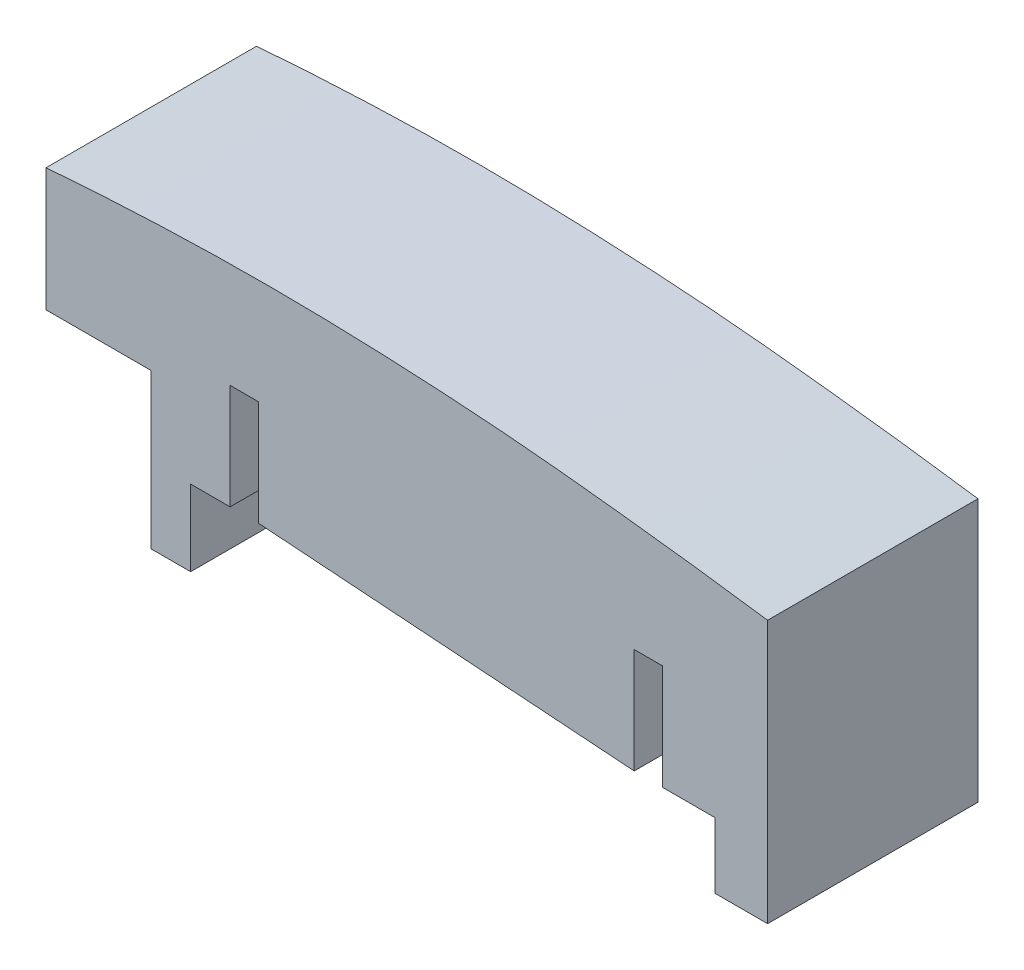
ISO-10303-21;
HEADER;
FILE_DESCRIPTION(('STEP AP214'),'2;1');
FILE_NAME('part.step','',(''),(''),'','','');
FILE_SCHEMA(('AUTOMOTIVE_DESIGN { 1 0 10303 214 1 1 1 1 }'));
ENDSEC;
DATA;
#1=APPLICATION_CONTEXT('core data for automotive mechanical design processes');
#2=APPLICATION_PROTOCOL_DEFINITION('international standard','automotive_design',2000,#1);
#3=PRODUCT_CONTEXT('',#1,'mechanical');
#4=PRODUCT('Part','Part','',(#3));
#5=PRODUCT_RELATED_PRODUCT_CATEGORY('part','',(#4));
#6=PRODUCT_DEFINITION_FORMATION('','',#4);
#7=PRODUCT_DEFINITION_CONTEXT('part definition',#1,'design');
#8=PRODUCT_DEFINITION('design','',#6,#7);
#9=PRODUCT_DEFINITION_SHAPE('','',#8);
#10=(LENGTH_UNIT() NAMED_UNIT(*) SI_UNIT(.MILLI.,.METRE.));
#11=(NAMED_UNIT(*) PLANE_ANGLE_UNIT() SI_UNIT($,.RADIAN.));
#12=(NAMED_UNIT(*) SI_UNIT($,.STERADIAN.) SOLID_ANGLE_UNIT());
#13=UNCERTAINTY_MEASURE_WITH_UNIT(LENGTH_MEASURE(1.E-05),#10,'distance_accuracy_value','');
#14=(GEOMETRIC_REPRESENTATION_CONTEXT(3) GLOBAL_UNCERTAINTY_ASSIGNED_CONTEXT((#13)) GLOBAL_UNIT_ASSIGNED_CONTEXT((#10,
#11,#12)) REPRESENTATION_CONTEXT('',''));
#15=CARTESIAN_POINT('',(0.,0.,0.));
#16=DIRECTION('',(0.,0.,1.));
#17=DIRECTION('',(1.,0.,0.));
#18=AXIS2_PLACEMENT_3D('',#15,#16,#17);
#19=CARTESIAN_POINT('',(2295.10171506552,2967.62554905265,25.4));
#20=CARTESIAN_POINT('',(2290.06442446586,2968.34608124292,25.4));
#21=CARTESIAN_POINT('',(2285.01231095638,2969.0082222592,25.4));
#22=CARTESIAN_POINT('',(2275.66168840668,2970.09585933198,25.4));
#23=CARTESIAN_POINT('',(2271.46891104018,2970.56199263121,25.4));
#24=CARTESIAN_POINT('',(2263.712580892,2971.28406665262,25.4));
#25=CARTESIAN_POINT('',(2260.22175859021,2971.54419176705,25.4));
#26=CARTESIAN_POINT('',(2253.37604568081,2971.9627391919,25.4));
#27=CARTESIAN_POINT('',(2249.94437688068,2972.13076012665,25.4));
#28=CARTESIAN_POINT('',(2239.63060687212,2972.49491008887,25.4));
#29=CARTESIAN_POINT('',(2232.68443342731,2972.53940645631,25.4));
#30=CARTESIAN_POINT('',(2220.02607753454,2972.17801152931,25.4));
#31=CARTESIAN_POINT('',(2214.35356363256,2971.87581349315,25.4));
#32=CARTESIAN_POINT('',(2208.6346229576,2971.42471690238,25.4));
#33=CARTESIAN_POINT('',(2208.42061258464,2971.40783626747,25.4));
#34=CARTESIAN_POINT('',(2208.20653719768,2971.39074712157,25.4));
#35=CARTESIAN_POINT('',(2207.99241506552,2971.3735080559,25.4));
#36=B_SPLINE_CURVE_WITH_KNOTS('',3,(#19,#20,#21,#22,#23,#24,#25,#26,#27,#28,#29,#30,#31,#32,#33,
#34,#35),.UNSPECIFIED.,.F.,.F.,(4,2,2,2,2,2,3,4),(8.10263109564684,8.69301522847715,
9.18839543822775,9.58192884783723,9.97546225744671,10.7625290766657,11.4141270933179,
11.4385107584906),.UNSPECIFIED.);
#37=DIRECTION('',(0.,0.,-1.));
#38=VECTOR('',#37,1.);
#39=SURFACE_OF_LINEAR_EXTRUSION('',#36,#38);
#40=CARTESIAN_POINT('',(2295.10171506552,2967.62554905265,0.));
#41=CARTESIAN_POINT('',(2290.06442446586,2968.34608124292,0.));
#42=CARTESIAN_POINT('',(2285.01231095638,2969.0082222592,0.));
#43=CARTESIAN_POINT('',(2275.66168840668,2970.09585933198,0.));
#44=CARTESIAN_POINT('',(2271.46891104018,2970.56199263121,0.));
#45=CARTESIAN_POINT('',(2263.712580892,2971.28406665262,0.));
#46=CARTESIAN_POINT('',(2260.22175859021,2971.54419176705,0.));
#47=CARTESIAN_POINT('',(2253.37604568081,2971.9627391919,0.));
#48=CARTESIAN_POINT('',(2249.94437688068,2972.13076012665,0.));
#49=CARTESIAN_POINT('',(2239.63060687212,2972.49491008887,0.));
#50=CARTESIAN_POINT('',(2232.68443342731,2972.53940645631,0.));
#51=CARTESIAN_POINT('',(2220.02607753454,2972.17801152931,0.));
#52=CARTESIAN_POINT('',(2214.35356363256,2971.87581349315,0.));
#53=CARTESIAN_POINT('',(2208.6346229576,2971.42471690238,0.));
#54=CARTESIAN_POINT('',(2208.42061258464,2971.40783626747,0.));
#55=CARTESIAN_POINT('',(2208.20653719768,2971.39074712157,0.));
#56=CARTESIAN_POINT('',(2207.99241506552,2971.3735080559,0.));
#57=B_SPLINE_CURVE_WITH_KNOTS('',3,(#40,#41,#42,#43,#44,#45,#46,#47,#48,#49,#50,#51,#52,#53,#54,
#55,#56),.UNSPECIFIED.,.F.,.F.,(4,2,2,2,2,2,3,4),(8.10263109564684,8.69301522847715,
9.18839543822775,9.58192884783723,9.97546225744671,10.7625290766657,11.4141270933179,
11.4385107584906),.UNSPECIFIED.);
#58=CARTESIAN_POINT('',(2295.10171506552,2967.62554905265,0.));
#59=VERTEX_POINT('',#58);
#60=CARTESIAN_POINT('',(2207.99241506552,2971.3735080559,0.));
#61=VERTEX_POINT('',#60);
#62=EDGE_CURVE('E190',#59,#61,#57,.T.);
#63=ORIENTED_EDGE('',*,*,#62,.T.);
#64=DIRECTION('',(0.,0.,-1.));
#65=VECTOR('',#64,1.);
#66=CARTESIAN_POINT('',(2207.99241506552,2971.3735080559,25.4));
#67=LINE('',#66,#65);
#68=CARTESIAN_POINT('',(2207.99241506552,2971.3735080559,25.4));
#69=VERTEX_POINT('',#68);
#70=EDGE_CURVE('E11',#69,#61,#67,.T.);
#71=ORIENTED_EDGE('',*,*,#70,.F.);
#72=CARTESIAN_POINT('',(2295.10171506552,2967.62554905265,25.4));
#73=VERTEX_POINT('',#72);
#74=EDGE_CURVE('E229',#73,#69,#36,.T.);
#75=ORIENTED_EDGE('',*,*,#74,.F.);
#76=DIRECTION('',(0.,0.,-1.));
#77=VECTOR('',#76,1.);
#78=CARTESIAN_POINT('',(2295.10171506552,2967.62554905265,25.4));
#79=LINE('',#78,#77);
#80=EDGE_CURVE('E186',#73,#59,#79,.T.);
#81=ORIENTED_EDGE('',*,*,#80,.T.);
#82=EDGE_LOOP('',(#63,#71,#75,#81));
#83=FACE_BOUND('',#82,.T.);
#84=ADVANCED_FACE('F33',(#83),#39,.F.);
#85=CARTESIAN_POINT('',(2207.99241506552,2971.3735080559,25.4));
#86=DIRECTION('',(1.,-1.19587380324612E-13,0.));
#87=DIRECTION('',(1.19587380324612E-13,1.,0.));
#88=AXIS2_PLACEMENT_3D('',#85,#86,#87);
#89=PLANE('',#88);
#90=DIRECTION('',(-1.19587380324612E-13,-1.,0.));
#91=VECTOR('',#90,1.);
#92=CARTESIAN_POINT('',(2207.99241506552,2971.3735080559,0.));
#93=LINE('',#92,#91);
#94=CARTESIAN_POINT('',(2207.99241506552,2956.519458786,0.));
#95=VERTEX_POINT('',#94);
#96=EDGE_CURVE('E195',#61,#95,#93,.T.);
#97=ORIENTED_EDGE('',*,*,#96,.T.);
#98=DIRECTION('',(0.,0.,-1.));
#99=VECTOR('',#98,1.);
#100=CARTESIAN_POINT('',(2207.99241506552,2956.519458786,25.4));
#101=LINE('',#100,#99);
#102=CARTESIAN_POINT('',(2207.99241506552,2956.519458786,25.4));
#103=VERTEX_POINT('',#102);
#104=EDGE_CURVE('E42',#103,#95,#101,.T.);
#105=ORIENTED_EDGE('',*,*,#104,.F.);
#106=DIRECTION('',(-1.19587380324612E-13,-1.,0.));
#107=VECTOR('',#106,1.);
#108=CARTESIAN_POINT('',(2207.99241506552,2971.3735080559,25.4));
#109=LINE('',#108,#107);
#110=EDGE_CURVE('E123',#69,#103,#109,.T.);
#111=ORIENTED_EDGE('',*,*,#110,.F.);
#112=ORIENTED_EDGE('',*,*,#70,.T.);
#113=EDGE_LOOP('',(#97,#105,#111,#112));
#114=FACE_BOUND('',#113,.T.);
#115=ADVANCED_FACE('F337',(#114),#89,.F.);
#116=CARTESIAN_POINT('',(2220.69241506551,2956.51945878599,25.4));
#117=DIRECTION('',(1.04902962956743E-13,1.,0.));
#118=DIRECTION('',(-1.,1.04902962956743E-13,0.));
#119=AXIS2_PLACEMENT_3D('',#116,#117,#118);
#120=PLANE('',#119);
#121=DIRECTION('',(1.,-1.04902962956743E-13,0.));
#122=VECTOR('',#121,1.);
#123=CARTESIAN_POINT('',(2220.69241506551,2956.51945878599,0.));
#124=LINE('',#123,#122);
#125=CARTESIAN_POINT('',(2220.69241506551,2956.51945878599,0.));
#126=VERTEX_POINT('',#125);
#127=EDGE_CURVE('E200',#95,#126,#124,.T.);
#128=ORIENTED_EDGE('',*,*,#127,.T.);
#129=DIRECTION('',(0.,0.,-1.));
#130=VECTOR('',#129,1.);
#131=CARTESIAN_POINT('',(2220.69241506551,2956.51945878599,25.4));
#132=LINE('',#131,#130);
#133=CARTESIAN_POINT('',(2220.69241506551,2956.51945878599,25.4));
#134=VERTEX_POINT('',#133);
#135=EDGE_CURVE('E266',#134,#126,#132,.T.);
#136=ORIENTED_EDGE('',*,*,#135,.F.);
#137=DIRECTION('',(1.,-1.04902962956743E-13,0.));
#138=VECTOR('',#137,1.);
#139=CARTESIAN_POINT('',(2220.69241506551,2956.51945878599,25.4));
#140=LINE('',#139,#138);
#141=EDGE_CURVE('E274',#103,#134,#140,.T.);
#142=ORIENTED_EDGE('',*,*,#141,.F.);
#143=ORIENTED_EDGE('',*,*,#104,.T.);
#144=EDGE_LOOP('',(#128,#136,#142,#143));
#145=FACE_BOUND('',#144,.T.);
#146=ADVANCED_FACE('F272',(#145),#120,.F.);
#147=CARTESIAN_POINT('',(2220.69241506551,2956.51945878599,25.4));
#148=DIRECTION('',(1.,1.19070852667713E-13,0.));
#149=DIRECTION('',(-1.19070852667713E-13,1.,0.));
#150=AXIS2_PLACEMENT_3D('',#147,#148,#149);
#151=PLANE('',#150);
#152=DIRECTION('',(1.19070852667713E-13,-1.,0.));
#153=VECTOR('',#152,1.);
#154=CARTESIAN_POINT('',(2220.69241506551,2956.51945878599,0.));
#155=LINE('',#154,#153);
#156=CARTESIAN_POINT('',(2220.69241506552,2937.87135138185,0.));
#157=VERTEX_POINT('',#156);
#158=EDGE_CURVE('E202',#126,#157,#155,.T.);
#159=ORIENTED_EDGE('',*,*,#158,.T.);
#160=DIRECTION('',(0.,0.,-1.));
#161=VECTOR('',#160,1.);
#162=CARTESIAN_POINT('',(2220.69241506552,2937.87135138185,25.4));
#163=LINE('',#162,#161);
#164=CARTESIAN_POINT('',(2220.69241506552,2937.87135138185,25.4));
#165=VERTEX_POINT('',#164);
#166=EDGE_CURVE('E263',#165,#157,#163,.T.);
#167=ORIENTED_EDGE('',*,*,#166,.F.);
#168=DIRECTION('',(1.19070852667713E-13,-1.,0.));
#169=VECTOR('',#168,1.);
#170=CARTESIAN_POINT('',(2220.69241506551,2956.51945878599,25.4));
#171=LINE('',#170,#169);
#172=EDGE_CURVE('E292',#134,#165,#171,.T.);
#173=ORIENTED_EDGE('',*,*,#172,.F.);
#174=ORIENTED_EDGE('',*,*,#135,.T.);
#175=EDGE_LOOP('',(#159,#167,#173,#174));
#176=FACE_BOUND('',#175,.T.);
#177=ADVANCED_FACE('F283',(#176),#151,.F.);
#178=CARTESIAN_POINT('',(2225.45491506552,2937.87135138185,25.4));
#179=DIRECTION('',(1.86494156367445E-13,1.,0.));
#180=DIRECTION('',(-1.,1.86494156367445E-13,0.));
#181=AXIS2_PLACEMENT_3D('',#178,#179,#180);
#182=PLANE('',#181);
#183=DIRECTION('',(1.,-1.86494156367445E-13,0.));
#184=VECTOR('',#183,1.);
#185=CARTESIAN_POINT('',(2225.45491506552,2937.87135138185,0.));
#186=LINE('',#185,#184);
#187=CARTESIAN_POINT('',(2225.45491506552,2937.87135138185,0.));
#188=VERTEX_POINT('',#187);
#189=EDGE_CURVE('E204',#157,#188,#186,.T.);
#190=ORIENTED_EDGE('',*,*,#189,.T.);
#191=DIRECTION('',(0.,0.,-1.));
#192=VECTOR('',#191,1.);
#193=CARTESIAN_POINT('',(2225.45491506552,2937.87135138185,25.4));
#194=LINE('',#193,#192);
#195=CARTESIAN_POINT('',(2225.45491506552,2937.87135138185,25.4));
#196=VERTEX_POINT('',#195);
#197=EDGE_CURVE('E260',#196,#188,#194,.T.);
#198=ORIENTED_EDGE('',*,*,#197,.F.);
#199=DIRECTION('',(1.,-1.86494156367445E-13,0.));
#200=VECTOR('',#199,1.);
#201=CARTESIAN_POINT('',(2225.45491506552,2937.87135138185,25.4));
#202=LINE('',#201,#200);
#203=EDGE_CURVE('E289',#165,#196,#202,.T.);
#204=ORIENTED_EDGE('',*,*,#203,.F.);
#205=ORIENTED_EDGE('',*,*,#166,.T.);
#206=EDGE_LOOP('',(#190,#198,#204,#205));
#207=FACE_BOUND('',#206,.T.);
#208=ADVANCED_FACE('F287',(#207),#182,.F.);
#209=CARTESIAN_POINT('',(2225.45491506552,2947.03597977265,25.4));
#210=DIRECTION('',(-1.,0.,0.));
#211=DIRECTION('',(0.,0.,1.));
#212=AXIS2_PLACEMENT_3D('',#209,#210,#211);
#213=PLANE('',#212);
#214=DIRECTION('',(0.,1.,0.));
#215=VECTOR('',#214,1.);
#216=CARTESIAN_POINT('',(2225.45491506552,2947.03597977265,0.));
#217=LINE('',#216,#215);
#218=CARTESIAN_POINT('',(2225.45491506552,2947.03597977265,0.));
#219=VERTEX_POINT('',#218);
#220=EDGE_CURVE('E206',#188,#219,#217,.T.);
#221=ORIENTED_EDGE('',*,*,#220,.T.);
#222=DIRECTION('',(0.,0.,-1.));
#223=VECTOR('',#222,1.);
#224=CARTESIAN_POINT('',(2225.45491506552,2947.03597977265,25.4));
#225=LINE('',#224,#223);
#226=CARTESIAN_POINT('',(2225.45491506552,2947.03597977265,25.4));
#227=VERTEX_POINT('',#226);
#228=EDGE_CURVE('E257',#227,#219,#225,.T.);
#229=ORIENTED_EDGE('',*,*,#228,.F.);
#230=DIRECTION('',(0.,1.,0.));
#231=VECTOR('',#230,1.);
#232=CARTESIAN_POINT('',(2225.45491506552,2947.03597977265,25.4));
#233=LINE('',#232,#231);
#234=EDGE_CURVE('E291',#196,#227,#233,.T.);
#235=ORIENTED_EDGE('',*,*,#234,.F.);
#236=ORIENTED_EDGE('',*,*,#197,.T.);
#237=EDGE_LOOP('',(#221,#229,#235,#236));
#238=FACE_BOUND('',#237,.T.);
#239=ADVANCED_FACE('F350',(#238),#213,.F.);
#240=CARTESIAN_POINT('',(2225.45491506552,2947.03597977265,25.4));
#241=DIRECTION('',(0.,1.,0.));
#242=DIRECTION('',(-1.,0.,0.));
#243=AXIS2_PLACEMENT_3D('',#240,#241,#242);
#244=PLANE('',#243);
#245=DIRECTION('',(1.,0.,0.));
#246=VECTOR('',#245,1.);
#247=CARTESIAN_POINT('',(2225.45491506552,2947.03597977265,0.));
#248=LINE('',#247,#246);
#249=CARTESIAN_POINT('',(2230.21741506552,2947.03597977265,0.));
#250=VERTEX_POINT('',#249);
#251=EDGE_CURVE('E208',#219,#250,#248,.T.);
#252=ORIENTED_EDGE('',*,*,#251,.T.);
#253=DIRECTION('',(0.,0.,-1.));
#254=VECTOR('',#253,1.);
#255=CARTESIAN_POINT('',(2230.21741506552,2947.03597977265,25.4));
#256=LINE('',#255,#254);
#257=CARTESIAN_POINT('',(2230.21741506552,2947.03597977265,25.4));
#258=VERTEX_POINT('',#257);
#259=EDGE_CURVE('E254',#258,#250,#256,.T.);
#260=ORIENTED_EDGE('',*,*,#259,.F.);
#261=DIRECTION('',(1.,0.,0.));
#262=VECTOR('',#261,1.);
#263=CARTESIAN_POINT('',(2225.45491506552,2947.03597977265,25.4));
#264=LINE('',#263,#262);
#265=EDGE_CURVE('E294',#227,#258,#264,.T.);
#266=ORIENTED_EDGE('',*,*,#265,.F.);
#267=ORIENTED_EDGE('',*,*,#228,.T.);
#268=EDGE_LOOP('',(#252,#260,#266,#267));
#269=FACE_BOUND('',#268,.T.);
#270=ADVANCED_FACE('F353',(#269),#244,.F.);
#271=CARTESIAN_POINT('',(2230.21741506552,2959.73597977265,25.4));
#272=DIRECTION('',(-1.,0.,0.));
#273=DIRECTION('',(0.,0.,1.));
#274=AXIS2_PLACEMENT_3D('',#271,#272,#273);
#275=PLANE('',#274);
#276=DIRECTION('',(0.,1.,0.));
#277=VECTOR('',#276,1.);
#278=CARTESIAN_POINT('',(2230.21741506552,2959.73597977265,0.));
#279=LINE('',#278,#277);
#280=CARTESIAN_POINT('',(2230.21741506552,2959.73597977265,0.));
#281=VERTEX_POINT('',#280);
#282=EDGE_CURVE('E210',#250,#281,#279,.T.);
#283=ORIENTED_EDGE('',*,*,#282,.T.);
#284=DIRECTION('',(0.,0.,-1.));
#285=VECTOR('',#284,1.);
#286=CARTESIAN_POINT('',(2230.21741506552,2959.73597977265,25.4));
#287=LINE('',#286,#285);
#288=CARTESIAN_POINT('',(2230.21741506552,2959.73597977265,25.4));
#289=VERTEX_POINT('',#288);
#290=EDGE_CURVE('E251',#289,#281,#287,.T.);
#291=ORIENTED_EDGE('',*,*,#290,.F.);
#292=DIRECTION('',(0.,1.,0.));
#293=VECTOR('',#292,1.);
#294=CARTESIAN_POINT('',(2230.21741506552,2959.73597977265,25.4));
#295=LINE('',#294,#293);
#296=EDGE_CURVE('E300',#258,#289,#295,.T.);
#297=ORIENTED_EDGE('',*,*,#296,.F.);
#298=ORIENTED_EDGE('',*,*,#259,.T.);
#299=EDGE_LOOP('',(#283,#291,#297,#298));
#300=FACE_BOUND('',#299,.T.);
#301=ADVANCED_FACE('F357',(#300),#275,.F.);
#302=CARTESIAN_POINT('',(2230.21741506552,2959.73597977265,25.4));
#303=DIRECTION('',(0.,1.,0.));
#304=DIRECTION('',(0.,0.,1.));
#305=AXIS2_PLACEMENT_3D('',#302,#303,#304);
#306=PLANE('',#305);
#307=DIRECTION('',(1.,0.,0.));
#308=VECTOR('',#307,1.);
#309=CARTESIAN_POINT('',(2230.21741506552,2959.73597977265,0.));
#310=LINE('',#309,#308);
#311=CARTESIAN_POINT('',(2233.62101506552,2959.73597977265,0.));
#312=VERTEX_POINT('',#311);
#313=EDGE_CURVE('E212',#281,#312,#310,.T.);
#314=ORIENTED_EDGE('',*,*,#313,.T.);
#315=DIRECTION('',(0.,0.,-1.));
#316=VECTOR('',#315,1.);
#317=CARTESIAN_POINT('',(2233.62101506552,2959.73597977265,25.4));
#318=LINE('',#317,#316);
#319=CARTESIAN_POINT('',(2233.62101506552,2959.73597977265,25.4));
#320=VERTEX_POINT('',#319);
#321=EDGE_CURVE('E248',#320,#312,#318,.T.);
#322=ORIENTED_EDGE('',*,*,#321,.F.);
#323=DIRECTION('',(1.,0.,0.));
#324=VECTOR('',#323,1.);
#325=CARTESIAN_POINT('',(2230.21741506552,2959.73597977265,25.4));
#326=LINE('',#325,#324);
#327=EDGE_CURVE('E302',#289,#320,#326,.T.);
#328=ORIENTED_EDGE('',*,*,#327,.F.);
#329=ORIENTED_EDGE('',*,*,#290,.T.);
#330=EDGE_LOOP('',(#314,#322,#328,#329));
#331=FACE_BOUND('',#330,.T.);
#332=ADVANCED_FACE('F361',(#331),#306,.F.);
#333=CARTESIAN_POINT('',(2233.62101506552,2959.73597977265,25.4));
#334=DIRECTION('',(1.,0.,0.));
#335=DIRECTION('',(0.,0.,-1.));
#336=AXIS2_PLACEMENT_3D('',#333,#334,#335);
#337=PLANE('',#336);
#338=DIRECTION('',(0.,-1.,0.));
#339=VECTOR('',#338,1.);
#340=CARTESIAN_POINT('',(2233.62101506552,2959.73597977265,0.));
#341=LINE('',#340,#339);
#342=CARTESIAN_POINT('',(2233.62101506552,2947.03597977265,0.));
#343=VERTEX_POINT('',#342);
#344=EDGE_CURVE('E214',#312,#343,#341,.T.);
#345=ORIENTED_EDGE('',*,*,#344,.T.);
#346=DIRECTION('',(0.,0.,-1.));
#347=VECTOR('',#346,1.);
#348=CARTESIAN_POINT('',(2233.62101506552,2947.03597977265,25.4));
#349=LINE('',#348,#347);
#350=CARTESIAN_POINT('',(2233.62101506552,2947.03597977265,25.4));
#351=VERTEX_POINT('',#350);
#352=EDGE_CURVE('E245',#351,#343,#349,.T.);
#353=ORIENTED_EDGE('',*,*,#352,.F.);
#354=DIRECTION('',(0.,-1.,0.));
#355=VECTOR('',#354,1.);
#356=CARTESIAN_POINT('',(2233.62101506552,2959.73597977265,25.4));
#357=LINE('',#356,#355);
#358=EDGE_CURVE('E304',#320,#351,#357,.T.);
#359=ORIENTED_EDGE('',*,*,#358,.F.);
#360=ORIENTED_EDGE('',*,*,#321,.T.);
#361=EDGE_LOOP('',(#345,#353,#359,#360));
#362=FACE_BOUND('',#361,.T.);
#363=ADVANCED_FACE('F365',(#362),#337,.F.);
#364=CARTESIAN_POINT('',(2233.62101506552,2947.03597977265,25.4));
#365=DIRECTION('',(0.0708878089630398,0.997484294884095,0.));
#366=DIRECTION('',(-0.997484294884095,0.0708878089630398,0.));
#367=AXIS2_PLACEMENT_3D('',#364,#365,#366);
#368=PLANE('',#367);
#369=DIRECTION('',(0.997484294884095,-0.0708878089630398,0.));
#370=VECTOR('',#369,1.);
#371=CARTESIAN_POINT('',(2233.62101506552,2947.03597977265,0.));
#372=LINE('',#371,#370);
#373=CARTESIAN_POINT('',(2278.99811506552,2943.81118394118,0.));
#374=VERTEX_POINT('',#373);
#375=EDGE_CURVE('E216',#343,#374,#372,.T.);
#376=ORIENTED_EDGE('',*,*,#375,.T.);
#377=DIRECTION('',(0.,0.,-1.));
#378=VECTOR('',#377,1.);
#379=CARTESIAN_POINT('',(2278.99811506552,2943.81118394118,25.4));
#380=LINE('',#379,#378);
#381=CARTESIAN_POINT('',(2278.99811506552,2943.81118394118,25.4));
#382=VERTEX_POINT('',#381);
#383=EDGE_CURVE('E242',#382,#374,#380,.T.);
#384=ORIENTED_EDGE('',*,*,#383,.F.);
#385=DIRECTION('',(0.997484294884095,-0.0708878089630398,0.));
#386=VECTOR('',#385,1.);
#387=CARTESIAN_POINT('',(2233.62101506552,2947.03597977265,25.4));
#388=LINE('',#387,#386);
#389=EDGE_CURVE('E306',#351,#382,#388,.T.);
#390=ORIENTED_EDGE('',*,*,#389,.F.);
#391=ORIENTED_EDGE('',*,*,#352,.T.);
#392=EDGE_LOOP('',(#376,#384,#390,#391));
#393=FACE_BOUND('',#392,.T.);
#394=ADVANCED_FACE('F369',(#393),#368,.F.);
#395=CARTESIAN_POINT('',(2278.99811506552,2956.51118394118,25.4));
#396=DIRECTION('',(-1.,0.,0.));
#397=DIRECTION('',(0.,0.,1.));
#398=AXIS2_PLACEMENT_3D('',#395,#396,#397);
#399=PLANE('',#398);
#400=DIRECTION('',(0.,1.,0.));
#401=VECTOR('',#400,1.);
#402=CARTESIAN_POINT('',(2278.99811506552,2956.51118394118,0.));
#403=LINE('',#402,#401);
#404=CARTESIAN_POINT('',(2278.99811506552,2956.51118394118,0.));
#405=VERTEX_POINT('',#404);
#406=EDGE_CURVE('E218',#374,#405,#403,.T.);
#407=ORIENTED_EDGE('',*,*,#406,.T.);
#408=DIRECTION('',(0.,0.,-1.));
#409=VECTOR('',#408,1.);
#410=CARTESIAN_POINT('',(2278.99811506552,2956.51118394118,25.4));
#411=LINE('',#410,#409);
#412=CARTESIAN_POINT('',(2278.99811506552,2956.51118394118,25.4));
#413=VERTEX_POINT('',#412);
#414=EDGE_CURVE('E239',#413,#405,#411,.T.);
#415=ORIENTED_EDGE('',*,*,#414,.F.);
#416=DIRECTION('',(0.,1.,0.));
#417=VECTOR('',#416,1.);
#418=CARTESIAN_POINT('',(2278.99811506552,2956.51118394118,25.4));
#419=LINE('',#418,#417);
#420=EDGE_CURVE('E308',#382,#413,#419,.T.);
#421=ORIENTED_EDGE('',*,*,#420,.F.);
#422=ORIENTED_EDGE('',*,*,#383,.T.);
#423=EDGE_LOOP('',(#407,#415,#421,#422));
#424=FACE_BOUND('',#423,.T.);
#425=ADVANCED_FACE('F373',(#424),#399,.F.);
#426=CARTESIAN_POINT('',(2282.40171506552,2956.51118394118,25.4));
#427=DIRECTION('',(0.,1.,0.));
#428=DIRECTION('',(0.,0.,1.));
#429=AXIS2_PLACEMENT_3D('',#426,#427,#428);
#430=PLANE('',#429);
#431=DIRECTION('',(1.,0.,0.));
#432=VECTOR('',#431,1.);
#433=CARTESIAN_POINT('',(2282.40171506552,2956.51118394118,0.));
#434=LINE('',#433,#432);
#435=CARTESIAN_POINT('',(2282.40171506552,2956.51118394118,0.));
#436=VERTEX_POINT('',#435);
#437=EDGE_CURVE('E220',#405,#436,#434,.T.);
#438=ORIENTED_EDGE('',*,*,#437,.T.);
#439=DIRECTION('',(0.,0.,-1.));
#440=VECTOR('',#439,1.);
#441=CARTESIAN_POINT('',(2282.40171506552,2956.51118394118,25.4));
#442=LINE('',#441,#440);
#443=CARTESIAN_POINT('',(2282.40171506552,2956.51118394118,25.4));
#444=VERTEX_POINT('',#443);
#445=EDGE_CURVE('E236',#444,#436,#442,.T.);
#446=ORIENTED_EDGE('',*,*,#445,.F.);
#447=DIRECTION('',(1.,0.,0.));
#448=VECTOR('',#447,1.);
#449=CARTESIAN_POINT('',(2282.40171506552,2956.51118394118,25.4));
#450=LINE('',#449,#448);
#451=EDGE_CURVE('E310',#413,#444,#450,.T.);
#452=ORIENTED_EDGE('',*,*,#451,.F.);
#453=ORIENTED_EDGE('',*,*,#414,.T.);
#454=EDGE_LOOP('',(#438,#446,#452,#453));
#455=FACE_BOUND('',#454,.T.);
#456=ADVANCED_FACE('F377',(#455),#430,.F.);
#457=CARTESIAN_POINT('',(2282.40171506552,2956.51118394118,25.4));
#458=DIRECTION('',(1.,0.,0.));
#459=DIRECTION('',(0.,0.,-1.));
#460=AXIS2_PLACEMENT_3D('',#457,#458,#459);
#461=PLANE('',#460);
#462=DIRECTION('',(0.,-1.,0.));
#463=VECTOR('',#462,1.);
#464=CARTESIAN_POINT('',(2282.40171506552,2956.51118394118,0.));
#465=LINE('',#464,#463);
#466=CARTESIAN_POINT('',(2282.40171506552,2943.81118394118,0.));
#467=VERTEX_POINT('',#466);
#468=EDGE_CURVE('E222',#436,#467,#465,.T.);
#469=ORIENTED_EDGE('',*,*,#468,.T.);
#470=DIRECTION('',(0.,0.,-1.));
#471=VECTOR('',#470,1.);
#472=CARTESIAN_POINT('',(2282.40171506552,2943.81118394118,25.4));
#473=LINE('',#472,#471);
#474=CARTESIAN_POINT('',(2282.40171506552,2943.81118394118,25.4));
#475=VERTEX_POINT('',#474);
#476=EDGE_CURVE('E233',#475,#467,#473,.T.);
#477=ORIENTED_EDGE('',*,*,#476,.F.);
#478=DIRECTION('',(0.,-1.,0.));
#479=VECTOR('',#478,1.);
#480=CARTESIAN_POINT('',(2282.40171506552,2956.51118394118,25.4));
#481=LINE('',#480,#479);
#482=EDGE_CURVE('E312',#444,#475,#481,.T.);
#483=ORIENTED_EDGE('',*,*,#482,.F.);
#484=ORIENTED_EDGE('',*,*,#445,.T.);
#485=EDGE_LOOP('',(#469,#477,#483,#484));
#486=FACE_BOUND('',#485,.T.);
#487=ADVANCED_FACE('F318',(#486),#461,.F.);
#488=CARTESIAN_POINT('',(2288.75171506552,2943.81118394118,25.4));
#489=DIRECTION('',(1.39870617275604E-13,1.,0.));
#490=DIRECTION('',(-1.,1.39870617275604E-13,0.));
#491=AXIS2_PLACEMENT_3D('',#488,#489,#490);
#492=PLANE('',#491);
#493=DIRECTION('',(1.,-1.39870617275604E-13,0.));
#494=VECTOR('',#493,1.);
#495=CARTESIAN_POINT('',(2288.75171506552,2943.81118394118,0.));
#496=LINE('',#495,#494);
#497=CARTESIAN_POINT('',(2288.75171506552,2943.81118394118,0.));
#498=VERTEX_POINT('',#497);
#499=EDGE_CURVE('E224',#467,#498,#496,.T.);
#500=ORIENTED_EDGE('',*,*,#499,.T.);
#501=DIRECTION('',(0.,0.,-1.));
#502=VECTOR('',#501,1.);
#503=CARTESIAN_POINT('',(2288.75171506552,2943.81118394118,25.4));
#504=LINE('',#503,#502);
#505=CARTESIAN_POINT('',(2288.75171506552,2943.81118394118,25.4));
#506=VERTEX_POINT('',#505);
#507=EDGE_CURVE('E181',#506,#498,#504,.T.);
#508=ORIENTED_EDGE('',*,*,#507,.F.);
#509=DIRECTION('',(1.,-1.39870617275604E-13,0.));
#510=VECTOR('',#509,1.);
#511=CARTESIAN_POINT('',(2288.75171506552,2943.81118394118,25.4));
#512=LINE('',#511,#510);
#513=EDGE_CURVE('E172',#475,#506,#512,.T.);
#514=ORIENTED_EDGE('',*,*,#513,.F.);
#515=ORIENTED_EDGE('',*,*,#476,.T.);
#516=EDGE_LOOP('',(#500,#508,#514,#515));
#517=FACE_BOUND('',#516,.T.);
#518=ADVANCED_FACE('F322',(#517),#492,.F.);
#519=CARTESIAN_POINT('',(2288.75171506552,2943.81118394118,25.4));
#520=DIRECTION('',(1.,0.,0.));
#521=DIRECTION('',(0.,0.,-1.));
#522=AXIS2_PLACEMENT_3D('',#519,#520,#521);
#523=PLANE('',#522);
#524=DIRECTION('',(0.,-1.,0.));
#525=VECTOR('',#524,1.);
#526=CARTESIAN_POINT('',(2288.75171506552,2943.81118394118,0.));
#527=LINE('',#526,#525);
#528=CARTESIAN_POINT('',(2288.75171506552,2935.89705673565,0.));
#529=VERTEX_POINT('',#528);
#530=EDGE_CURVE('E180',#498,#529,#527,.T.);
#531=ORIENTED_EDGE('',*,*,#530,.T.);
#532=DIRECTION('',(0.,0.,-1.));
#533=VECTOR('',#532,1.);
#534=CARTESIAN_POINT('',(2288.75171506552,2935.89705673565,25.4));
#535=LINE('',#534,#533);
#536=CARTESIAN_POINT('',(2288.75171506552,2935.89705673565,25.4));
#537=VERTEX_POINT('',#536);
#538=EDGE_CURVE('E177',#537,#529,#535,.T.);
#539=ORIENTED_EDGE('',*,*,#538,.F.);
#540=DIRECTION('',(0.,-1.,0.));
#541=VECTOR('',#540,1.);
#542=CARTESIAN_POINT('',(2288.75171506552,2943.81118394118,25.4));
#543=LINE('',#542,#541);
#544=EDGE_CURVE('E166',#506,#537,#543,.T.);
#545=ORIENTED_EDGE('',*,*,#544,.F.);
#546=ORIENTED_EDGE('',*,*,#507,.T.);
#547=EDGE_LOOP('',(#531,#539,#545,#546));
#548=FACE_BOUND('',#547,.T.);
#549=ADVANCED_FACE('F178',(#548),#523,.F.);
#550=CARTESIAN_POINT('',(2288.75171506552,2935.89705673565,25.4));
#551=DIRECTION('',(0.,1.,0.));
#552=DIRECTION('',(0.,0.,1.));
#553=AXIS2_PLACEMENT_3D('',#550,#551,#552);
#554=PLANE('',#553);
#555=DIRECTION('',(1.,0.,0.));
#556=VECTOR('',#555,1.);
#557=CARTESIAN_POINT('',(2288.75171506552,2935.89705673565,0.));
#558=LINE('',#557,#556);
#559=CARTESIAN_POINT('',(2295.10171506552,2935.89705673565,0.));
#560=VERTEX_POINT('',#559);
#561=EDGE_CURVE('E109',#529,#560,#558,.T.);
#562=ORIENTED_EDGE('',*,*,#561,.T.);
#563=DIRECTION('',(0.,0.,-1.));
#564=VECTOR('',#563,1.);
#565=CARTESIAN_POINT('',(2295.10171506552,2935.89705673565,25.4));
#566=LINE('',#565,#564);
#567=CARTESIAN_POINT('',(2295.10171506552,2935.89705673565,25.4));
#568=VERTEX_POINT('',#567);
#569=EDGE_CURVE('E182',#568,#560,#566,.T.);
#570=ORIENTED_EDGE('',*,*,#569,.F.);
#571=DIRECTION('',(1.,0.,0.));
#572=VECTOR('',#571,1.);
#573=CARTESIAN_POINT('',(2288.75171506552,2935.89705673565,25.4));
#574=LINE('',#573,#572);
#575=EDGE_CURVE('E170',#537,#568,#574,.T.);
#576=ORIENTED_EDGE('',*,*,#575,.F.);
#577=ORIENTED_EDGE('',*,*,#538,.T.);
#578=EDGE_LOOP('',(#562,#570,#576,#577));
#579=FACE_BOUND('',#578,.T.);
#580=ADVANCED_FACE('F184',(#579),#554,.F.);
#581=CARTESIAN_POINT('',(2295.10171506552,2967.62554905265,25.4));
#582=DIRECTION('',(-1.,0.,0.));
#583=DIRECTION('',(0.,-1.,0.));
#584=AXIS2_PLACEMENT_3D('',#581,#582,#583);
#585=PLANE('',#584);
#586=DIRECTION('',(0.,1.,0.));
#587=VECTOR('',#586,1.);
#588=CARTESIAN_POINT('',(2295.10171506552,2967.62554905265,0.));
#589=LINE('',#588,#587);
#590=EDGE_CURVE('E115',#560,#59,#589,.T.);
#591=ORIENTED_EDGE('',*,*,#590,.T.);
#592=ORIENTED_EDGE('',*,*,#80,.F.);
#593=DIRECTION('',(0.,1.,0.));
#594=VECTOR('',#593,1.);
#595=CARTESIAN_POINT('',(2295.10171506552,2967.62554905265,25.4));
#596=LINE('',#595,#594);
#597=EDGE_CURVE('E50',#568,#73,#596,.T.);
#598=ORIENTED_EDGE('',*,*,#597,.F.);
#599=ORIENTED_EDGE('',*,*,#569,.T.);
#600=EDGE_LOOP('',(#591,#592,#598,#599));
#601=FACE_BOUND('',#600,.T.);
#602=ADVANCED_FACE('F326',(#601),#585,.F.);
#603=CARTESIAN_POINT('',(2251.87082242437,2972.02538405329,25.4));
#604=DIRECTION('',(0.,0.,-1.));
#605=DIRECTION('',(-1.,0.,0.));
#606=AXIS2_PLACEMENT_3D('',#603,#604,#605);
#607=PLANE('',#606);
#608=ORIENTED_EDGE('',*,*,#74,.T.);
#609=ORIENTED_EDGE('',*,*,#110,.T.);
#610=ORIENTED_EDGE('',*,*,#141,.T.);
#611=ORIENTED_EDGE('',*,*,#172,.T.);
#612=ORIENTED_EDGE('',*,*,#203,.T.);
#613=ORIENTED_EDGE('',*,*,#234,.T.);
#614=ORIENTED_EDGE('',*,*,#265,.T.);
#615=ORIENTED_EDGE('',*,*,#296,.T.);
#616=ORIENTED_EDGE('',*,*,#327,.T.);
#617=ORIENTED_EDGE('',*,*,#358,.T.);
#618=ORIENTED_EDGE('',*,*,#389,.T.);
#619=ORIENTED_EDGE('',*,*,#420,.T.);
#620=ORIENTED_EDGE('',*,*,#451,.T.);
#621=ORIENTED_EDGE('',*,*,#482,.T.);
#622=ORIENTED_EDGE('',*,*,#513,.T.);
#623=ORIENTED_EDGE('',*,*,#544,.T.);
#624=ORIENTED_EDGE('',*,*,#575,.T.);
#625=ORIENTED_EDGE('',*,*,#597,.T.);
#626=EDGE_LOOP('',(#608,#609,#610,#611,#612,#613,#614,#615,#616,#617,#618,#619,#620,#621,#622,
#623,#624,#625));
#627=FACE_BOUND('',#626,.T.);
#628=ADVANCED_FACE('F168',(#627),#607,.F.);
#629=CARTESIAN_POINT('',(2251.87082242437,2972.02538405329,0.));
#630=DIRECTION('',(0.,0.,-1.));
#631=DIRECTION('',(-1.,0.,0.));
#632=AXIS2_PLACEMENT_3D('',#629,#630,#631);
#633=PLANE('',#632);
#634=ORIENTED_EDGE('',*,*,#62,.F.);
#635=ORIENTED_EDGE('',*,*,#590,.F.);
#636=ORIENTED_EDGE('',*,*,#561,.F.);
#637=ORIENTED_EDGE('',*,*,#530,.F.);
#638=ORIENTED_EDGE('',*,*,#499,.F.);
#639=ORIENTED_EDGE('',*,*,#468,.F.);
#640=ORIENTED_EDGE('',*,*,#437,.F.);
#641=ORIENTED_EDGE('',*,*,#406,.F.);
#642=ORIENTED_EDGE('',*,*,#375,.F.);
#643=ORIENTED_EDGE('',*,*,#344,.F.);
#644=ORIENTED_EDGE('',*,*,#313,.F.);
#645=ORIENTED_EDGE('',*,*,#282,.F.);
#646=ORIENTED_EDGE('',*,*,#251,.F.);
#647=ORIENTED_EDGE('',*,*,#220,.F.);
#648=ORIENTED_EDGE('',*,*,#189,.F.);
#649=ORIENTED_EDGE('',*,*,#158,.F.);
#650=ORIENTED_EDGE('',*,*,#127,.F.);
#651=ORIENTED_EDGE('',*,*,#96,.F.);
#652=EDGE_LOOP('',(#634,#635,#636,#637,#638,#639,#640,#641,#642,#643,#644,#645,#646,#647,#648,
#649,#650,#651));
#653=FACE_BOUND('',#652,.T.);
#654=ADVANCED_FACE('F278',(#653),#633,.T.);
#655=CLOSED_SHELL('',(#84,#115,#146,#177,#208,#239,#270,#301,#332,#363,#394,#425,#456,#487,#518,
#549,#580,#602,#628,#654));
#656=MANIFOLD_SOLID_BREP('B2',#655);
#657=ADVANCED_BREP_SHAPE_REPRESENTATION('',(#18,#656),#14);
#658=SHAPE_DEFINITION_REPRESENTATION(#9,#657);
ENDSEC;
END-ISO-10303-21;
